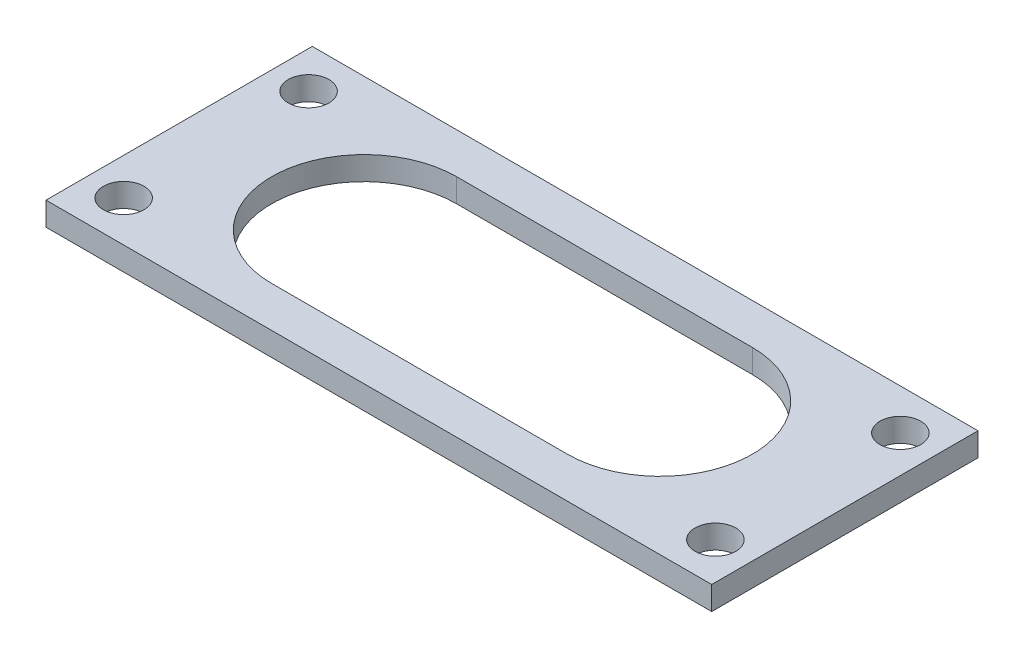
ISO-10303-21;
HEADER;
FILE_DESCRIPTION(('STEP AP214'),'2;1');
FILE_NAME('part.step','',(''),(''),'','','');
FILE_SCHEMA(('AUTOMOTIVE_DESIGN { 1 0 10303 214 1 1 1 1 }'));
ENDSEC;
DATA;
#1=APPLICATION_CONTEXT('core data for automotive mechanical design processes');
#2=APPLICATION_PROTOCOL_DEFINITION('international standard','automotive_design',2000,#1);
#3=PRODUCT_CONTEXT('',#1,'mechanical');
#4=PRODUCT('Part','Part','',(#3));
#5=PRODUCT_RELATED_PRODUCT_CATEGORY('part','',(#4));
#6=PRODUCT_DEFINITION_FORMATION('','',#4);
#7=PRODUCT_DEFINITION_CONTEXT('part definition',#1,'design');
#8=PRODUCT_DEFINITION('design','',#6,#7);
#9=PRODUCT_DEFINITION_SHAPE('','',#8);
#10=(LENGTH_UNIT() NAMED_UNIT(*) SI_UNIT(.MILLI.,.METRE.));
#11=(NAMED_UNIT(*) PLANE_ANGLE_UNIT() SI_UNIT($,.RADIAN.));
#12=(NAMED_UNIT(*) SI_UNIT($,.STERADIAN.) SOLID_ANGLE_UNIT());
#13=UNCERTAINTY_MEASURE_WITH_UNIT(LENGTH_MEASURE(1.E-05),#10,'distance_accuracy_value','');
#14=(GEOMETRIC_REPRESENTATION_CONTEXT(3) GLOBAL_UNCERTAINTY_ASSIGNED_CONTEXT((#13)) GLOBAL_UNIT_ASSIGNED_CONTEXT((#10,
#11,#12)) REPRESENTATION_CONTEXT('',''));
#15=CARTESIAN_POINT('',(0.,0.,0.));
#16=DIRECTION('',(0.,0.,1.));
#17=DIRECTION('',(1.,0.,0.));
#18=AXIS2_PLACEMENT_3D('',#15,#16,#17);
#19=CARTESIAN_POINT('',(-45.,3.175,18.));
#20=DIRECTION('',(1.,0.,0.));
#21=DIRECTION('',(0.,0.,-1.));
#22=AXIS2_PLACEMENT_3D('',#19,#20,#21);
#23=PLANE('',#22);
#24=DIRECTION('',(0.,0.,1.));
#25=VECTOR('',#24,1.);
#26=CARTESIAN_POINT('',(-45.,0.,18.));
#27=LINE('',#26,#25);
#28=CARTESIAN_POINT('',(-45.,0.,-18.));
#29=VERTEX_POINT('',#28);
#30=CARTESIAN_POINT('',(-45.,0.,18.));
#31=VERTEX_POINT('',#30);
#32=EDGE_CURVE('E169',#29,#31,#27,.T.);
#33=ORIENTED_EDGE('',*,*,#32,.T.);
#34=DIRECTION('',(0.,-1.,0.));
#35=VECTOR('',#34,1.);
#36=CARTESIAN_POINT('',(-45.,3.175,18.));
#37=LINE('',#36,#35);
#38=CARTESIAN_POINT('',(-45.,3.175,18.));
#39=VERTEX_POINT('',#38);
#40=EDGE_CURVE('E11',#39,#31,#37,.T.);
#41=ORIENTED_EDGE('',*,*,#40,.F.);
#42=DIRECTION('',(0.,0.,1.));
#43=VECTOR('',#42,1.);
#44=CARTESIAN_POINT('',(-45.,3.175,18.));
#45=LINE('',#44,#43);
#46=CARTESIAN_POINT('',(-45.,3.175,-18.));
#47=VERTEX_POINT('',#46);
#48=EDGE_CURVE('E170',#47,#39,#45,.T.);
#49=ORIENTED_EDGE('',*,*,#48,.F.);
#50=DIRECTION('',(0.,-1.,0.));
#51=VECTOR('',#50,1.);
#52=CARTESIAN_POINT('',(-45.,3.175,-18.));
#53=LINE('',#52,#51);
#54=EDGE_CURVE('E182',#47,#29,#53,.T.);
#55=ORIENTED_EDGE('',*,*,#54,.T.);
#56=EDGE_LOOP('',(#33,#41,#49,#55));
#57=FACE_BOUND('',#56,.T.);
#58=ADVANCED_FACE('F40',(#57),#23,.F.);
#59=CARTESIAN_POINT('',(45.,3.175,18.));
#60=DIRECTION('',(0.,0.,-1.));
#61=DIRECTION('',(-1.,0.,0.));
#62=AXIS2_PLACEMENT_3D('',#59,#60,#61);
#63=PLANE('',#62);
#64=DIRECTION('',(1.,0.,0.));
#65=VECTOR('',#64,1.);
#66=CARTESIAN_POINT('',(45.,0.,18.));
#67=LINE('',#66,#65);
#68=CARTESIAN_POINT('',(45.,0.,18.));
#69=VERTEX_POINT('',#68);
#70=EDGE_CURVE('E186',#31,#69,#67,.T.);
#71=ORIENTED_EDGE('',*,*,#70,.T.);
#72=DIRECTION('',(0.,-1.,0.));
#73=VECTOR('',#72,1.);
#74=CARTESIAN_POINT('',(45.,3.175,18.));
#75=LINE('',#74,#73);
#76=CARTESIAN_POINT('',(45.,3.175,18.));
#77=VERTEX_POINT('',#76);
#78=EDGE_CURVE('E47',#77,#69,#75,.T.);
#79=ORIENTED_EDGE('',*,*,#78,.F.);
#80=DIRECTION('',(1.,0.,0.));
#81=VECTOR('',#80,1.);
#82=CARTESIAN_POINT('',(45.,3.175,18.));
#83=LINE('',#82,#81);
#84=EDGE_CURVE('E174',#39,#77,#83,.T.);
#85=ORIENTED_EDGE('',*,*,#84,.F.);
#86=ORIENTED_EDGE('',*,*,#40,.T.);
#87=EDGE_LOOP('',(#71,#79,#85,#86));
#88=FACE_BOUND('',#87,.T.);
#89=ADVANCED_FACE('F217',(#88),#63,.F.);
#90=CARTESIAN_POINT('',(45.,3.175,18.));
#91=DIRECTION('',(-1.,0.,0.));
#92=DIRECTION('',(0.,0.,1.));
#93=AXIS2_PLACEMENT_3D('',#90,#91,#92);
#94=PLANE('',#93);
#95=DIRECTION('',(0.,0.,-1.));
#96=VECTOR('',#95,1.);
#97=CARTESIAN_POINT('',(45.,0.,18.));
#98=LINE('',#97,#96);
#99=CARTESIAN_POINT('',(45.,0.,-18.));
#100=VERTEX_POINT('',#99);
#101=EDGE_CURVE('E188',#69,#100,#98,.T.);
#102=ORIENTED_EDGE('',*,*,#101,.T.);
#103=DIRECTION('',(0.,-1.,0.));
#104=VECTOR('',#103,1.);
#105=CARTESIAN_POINT('',(45.,3.175,-18.));
#106=LINE('',#105,#104);
#107=CARTESIAN_POINT('',(45.,3.175,-18.));
#108=VERTEX_POINT('',#107);
#109=EDGE_CURVE('E195',#108,#100,#106,.T.);
#110=ORIENTED_EDGE('',*,*,#109,.F.);
#111=DIRECTION('',(0.,0.,-1.));
#112=VECTOR('',#111,1.);
#113=CARTESIAN_POINT('',(45.,3.175,18.));
#114=LINE('',#113,#112);
#115=EDGE_CURVE('E177',#77,#108,#114,.T.);
#116=ORIENTED_EDGE('',*,*,#115,.F.);
#117=ORIENTED_EDGE('',*,*,#78,.T.);
#118=EDGE_LOOP('',(#102,#110,#116,#117));
#119=FACE_BOUND('',#118,.T.);
#120=ADVANCED_FACE('F202',(#119),#94,.F.);
#121=CARTESIAN_POINT('',(45.,3.175,-18.));
#122=DIRECTION('',(0.,0.,1.));
#123=DIRECTION('',(1.,0.,0.));
#124=AXIS2_PLACEMENT_3D('',#121,#122,#123);
#125=PLANE('',#124);
#126=DIRECTION('',(-1.,0.,0.));
#127=VECTOR('',#126,1.);
#128=CARTESIAN_POINT('',(45.,0.,-18.));
#129=LINE('',#128,#127);
#130=EDGE_CURVE('E175',#100,#29,#129,.T.);
#131=ORIENTED_EDGE('',*,*,#130,.T.);
#132=ORIENTED_EDGE('',*,*,#54,.F.);
#133=DIRECTION('',(-1.,0.,0.));
#134=VECTOR('',#133,1.);
#135=CARTESIAN_POINT('',(45.,3.175,-18.));
#136=LINE('',#135,#134);
#137=EDGE_CURVE('E179',#108,#47,#136,.T.);
#138=ORIENTED_EDGE('',*,*,#137,.F.);
#139=ORIENTED_EDGE('',*,*,#109,.T.);
#140=EDGE_LOOP('',(#131,#132,#138,#139));
#141=FACE_BOUND('',#140,.T.);
#142=ADVANCED_FACE('F210',(#141),#125,.F.);
#143=CARTESIAN_POINT('',(0.,3.175,0.));
#144=DIRECTION('',(0.,1.,0.));
#145=DIRECTION('',(0.,0.,1.));
#146=AXIS2_PLACEMENT_3D('',#143,#144,#145);
#147=PLANE('',#146);
#148=CARTESIAN_POINT('',(20.,3.175,0.));
#149=DIRECTION('',(0.,1.,0.));
#150=DIRECTION('',(0.,0.,1.));
#151=AXIS2_PLACEMENT_3D('',#148,#149,#150);
#152=CIRCLE('',#151,12.5);
#153=CARTESIAN_POINT('',(20.,3.175,12.5));
#154=VERTEX_POINT('',#153);
#155=CARTESIAN_POINT('',(20.,3.175,-12.5));
#156=VERTEX_POINT('',#155);
#157=EDGE_CURVE('E54',#154,#156,#152,.T.);
#158=ORIENTED_EDGE('',*,*,#157,.F.);
#159=DIRECTION('',(1.,0.,0.));
#160=VECTOR('',#159,1.);
#161=CARTESIAN_POINT('',(20.,3.175,12.5));
#162=LINE('',#161,#160);
#163=CARTESIAN_POINT('',(-20.,3.175,12.5));
#164=VERTEX_POINT('',#163);
#165=EDGE_CURVE('E114',#164,#154,#162,.T.);
#166=ORIENTED_EDGE('',*,*,#165,.F.);
#167=CARTESIAN_POINT('',(-20.,3.175,0.));
#168=DIRECTION('',(0.,1.,0.));
#169=DIRECTION('',(0.,0.,1.));
#170=AXIS2_PLACEMENT_3D('',#167,#168,#169);
#171=CIRCLE('',#170,12.5);
#172=CARTESIAN_POINT('',(-20.,3.175,-12.5));
#173=VERTEX_POINT('',#172);
#174=EDGE_CURVE('E134',#173,#164,#171,.T.);
#175=ORIENTED_EDGE('',*,*,#174,.F.);
#176=DIRECTION('',(-1.,0.,0.));
#177=VECTOR('',#176,1.);
#178=CARTESIAN_POINT('',(20.,3.175,-12.5));
#179=LINE('',#178,#177);
#180=EDGE_CURVE('E128',#156,#173,#179,.T.);
#181=ORIENTED_EDGE('',*,*,#180,.F.);
#182=EDGE_LOOP('',(#158,#166,#175,#181));
#183=FACE_BOUND('',#182,.T.);
#184=CARTESIAN_POINT('',(40.,3.175,12.5));
#185=DIRECTION('',(0.,1.,0.));
#186=DIRECTION('',(0.,0.,1.));
#187=AXIS2_PLACEMENT_3D('',#184,#185,#186);
#188=CIRCLE('',#187,2.75);
#189=CARTESIAN_POINT('',(40.,3.175,15.25));
#190=VERTEX_POINT('',#189);
#191=EDGE_CURVE('E120',#190,#190,#188,.T.);
#192=ORIENTED_EDGE('',*,*,#191,.F.);
#193=EDGE_LOOP('',(#192));
#194=FACE_BOUND('',#193,.T.);
#195=CARTESIAN_POINT('',(-40.,3.175,12.5));
#196=DIRECTION('',(0.,1.,0.));
#197=DIRECTION('',(0.,0.,1.));
#198=AXIS2_PLACEMENT_3D('',#195,#196,#197);
#199=CIRCLE('',#198,2.74999999999999);
#200=CARTESIAN_POINT('',(-40.,3.175,15.25));
#201=VERTEX_POINT('',#200);
#202=EDGE_CURVE('E153',#201,#201,#199,.T.);
#203=ORIENTED_EDGE('',*,*,#202,.F.);
#204=EDGE_LOOP('',(#203));
#205=FACE_BOUND('',#204,.T.);
#206=CARTESIAN_POINT('',(-40.,3.175,-12.5));
#207=DIRECTION('',(0.,1.,0.));
#208=DIRECTION('',(0.,0.,1.));
#209=AXIS2_PLACEMENT_3D('',#206,#207,#208);
#210=CIRCLE('',#209,2.74999999999999);
#211=CARTESIAN_POINT('',(-40.,3.175,-9.75000000000001));
#212=VERTEX_POINT('',#211);
#213=EDGE_CURVE('E143',#212,#212,#210,.T.);
#214=ORIENTED_EDGE('',*,*,#213,.F.);
#215=EDGE_LOOP('',(#214));
#216=FACE_BOUND('',#215,.T.);
#217=CARTESIAN_POINT('',(40.,3.175,-12.5));
#218=DIRECTION('',(0.,1.,0.));
#219=DIRECTION('',(0.,0.,1.));
#220=AXIS2_PLACEMENT_3D('',#217,#218,#219);
#221=CIRCLE('',#220,2.75);
#222=CARTESIAN_POINT('',(40.,3.175,-9.75));
#223=VERTEX_POINT('',#222);
#224=EDGE_CURVE('E152',#223,#223,#221,.T.);
#225=ORIENTED_EDGE('',*,*,#224,.F.);
#226=EDGE_LOOP('',(#225));
#227=FACE_BOUND('',#226,.T.);
#228=ORIENTED_EDGE('',*,*,#48,.T.);
#229=ORIENTED_EDGE('',*,*,#84,.T.);
#230=ORIENTED_EDGE('',*,*,#115,.T.);
#231=ORIENTED_EDGE('',*,*,#137,.T.);
#232=EDGE_LOOP('',(#228,#229,#230,#231));
#233=FACE_BOUND('',#232,.T.);
#234=ADVANCED_FACE('F216',(#183,#194,#205,#216,#227,#233),#147,.T.);
#235=CARTESIAN_POINT('',(0.,0.,0.));
#236=DIRECTION('',(0.,1.,0.));
#237=DIRECTION('',(0.,0.,1.));
#238=AXIS2_PLACEMENT_3D('',#235,#236,#237);
#239=PLANE('',#238);
#240=DIRECTION('',(-1.,0.,0.));
#241=VECTOR('',#240,1.);
#242=CARTESIAN_POINT('',(20.,0.,12.5));
#243=LINE('',#242,#241);
#244=CARTESIAN_POINT('',(20.,0.,12.5));
#245=VERTEX_POINT('',#244);
#246=CARTESIAN_POINT('',(-20.,0.,12.5));
#247=VERTEX_POINT('',#246);
#248=EDGE_CURVE('E126',#245,#247,#243,.T.);
#249=ORIENTED_EDGE('',*,*,#248,.F.);
#250=CARTESIAN_POINT('',(20.,0.,0.));
#251=DIRECTION('',(0.,1.,0.));
#252=DIRECTION('',(0.,0.,1.));
#253=AXIS2_PLACEMENT_3D('',#250,#251,#252);
#254=CIRCLE('',#253,12.5);
#255=CARTESIAN_POINT('',(20.,0.,-12.5));
#256=VERTEX_POINT('',#255);
#257=EDGE_CURVE('E108',#256,#245,#254,.F.);
#258=ORIENTED_EDGE('',*,*,#257,.F.);
#259=DIRECTION('',(1.,0.,0.));
#260=VECTOR('',#259,1.);
#261=CARTESIAN_POINT('',(20.,0.,-12.5));
#262=LINE('',#261,#260);
#263=CARTESIAN_POINT('',(-20.,0.,-12.5));
#264=VERTEX_POINT('',#263);
#265=EDGE_CURVE('E117',#264,#256,#262,.T.);
#266=ORIENTED_EDGE('',*,*,#265,.F.);
#267=CARTESIAN_POINT('',(-20.,0.,0.));
#268=DIRECTION('',(0.,1.,0.));
#269=DIRECTION('',(0.,0.,1.));
#270=AXIS2_PLACEMENT_3D('',#267,#268,#269);
#271=CIRCLE('',#270,12.5);
#272=EDGE_CURVE('E62',#247,#264,#271,.F.);
#273=ORIENTED_EDGE('',*,*,#272,.F.);
#274=EDGE_LOOP('',(#249,#258,#266,#273));
#275=FACE_BOUND('',#274,.T.);
#276=CARTESIAN_POINT('',(40.,0.,12.5));
#277=DIRECTION('',(0.,1.,0.));
#278=DIRECTION('',(0.,0.,1.));
#279=AXIS2_PLACEMENT_3D('',#276,#277,#278);
#280=CIRCLE('',#279,2.75);
#281=CARTESIAN_POINT('',(40.,0.,15.25));
#282=VERTEX_POINT('',#281);
#283=EDGE_CURVE('E157',#282,#282,#280,.F.);
#284=ORIENTED_EDGE('',*,*,#283,.F.);
#285=EDGE_LOOP('',(#284));
#286=FACE_BOUND('',#285,.T.);
#287=CARTESIAN_POINT('',(-40.,0.,12.5));
#288=DIRECTION('',(0.,1.,0.));
#289=DIRECTION('',(0.,0.,1.));
#290=AXIS2_PLACEMENT_3D('',#287,#288,#289);
#291=CIRCLE('',#290,2.74999999999999);
#292=CARTESIAN_POINT('',(-40.,0.,15.25));
#293=VERTEX_POINT('',#292);
#294=EDGE_CURVE('E148',#293,#293,#291,.F.);
#295=ORIENTED_EDGE('',*,*,#294,.F.);
#296=EDGE_LOOP('',(#295));
#297=FACE_BOUND('',#296,.T.);
#298=CARTESIAN_POINT('',(-40.,0.,-12.5));
#299=DIRECTION('',(0.,1.,0.));
#300=DIRECTION('',(0.,0.,1.));
#301=AXIS2_PLACEMENT_3D('',#298,#299,#300);
#302=CIRCLE('',#301,2.74999999999999);
#303=CARTESIAN_POINT('',(-40.,0.,-9.75000000000001));
#304=VERTEX_POINT('',#303);
#305=EDGE_CURVE('E147',#304,#304,#302,.F.);
#306=ORIENTED_EDGE('',*,*,#305,.F.);
#307=EDGE_LOOP('',(#306));
#308=FACE_BOUND('',#307,.T.);
#309=CARTESIAN_POINT('',(40.,0.,-12.5));
#310=DIRECTION('',(0.,1.,0.));
#311=DIRECTION('',(0.,0.,1.));
#312=AXIS2_PLACEMENT_3D('',#309,#310,#311);
#313=CIRCLE('',#312,2.75);
#314=CARTESIAN_POINT('',(40.,0.,-9.75));
#315=VERTEX_POINT('',#314);
#316=EDGE_CURVE('E166',#315,#315,#313,.F.);
#317=ORIENTED_EDGE('',*,*,#316,.F.);
#318=EDGE_LOOP('',(#317));
#319=FACE_BOUND('',#318,.T.);
#320=ORIENTED_EDGE('',*,*,#32,.F.);
#321=ORIENTED_EDGE('',*,*,#130,.F.);
#322=ORIENTED_EDGE('',*,*,#101,.F.);
#323=ORIENTED_EDGE('',*,*,#70,.F.);
#324=EDGE_LOOP('',(#320,#321,#322,#323));
#325=FACE_BOUND('',#324,.T.);
#326=ADVANCED_FACE('F123',(#275,#286,#297,#308,#319,#325),#239,.F.);
#327=CARTESIAN_POINT('',(40.,-0.00100000000000013,-12.5));
#328=DIRECTION('',(0.,1.,0.));
#329=DIRECTION('',(0.,0.,1.));
#330=AXIS2_PLACEMENT_3D('',#327,#328,#329);
#331=CYLINDRICAL_SURFACE('',#330,2.75);
#332=ORIENTED_EDGE('',*,*,#224,.T.);
#333=EDGE_LOOP('',(#332));
#334=FACE_BOUND('',#333,.T.);
#335=ORIENTED_EDGE('',*,*,#316,.T.);
#336=EDGE_LOOP('',(#335));
#337=FACE_BOUND('',#336,.T.);
#338=ADVANCED_FACE('F229',(#334,#337),#331,.F.);
#339=CARTESIAN_POINT('',(-40.,-0.00100000000000013,-12.5));
#340=DIRECTION('',(0.,1.,0.));
#341=DIRECTION('',(0.,0.,1.));
#342=AXIS2_PLACEMENT_3D('',#339,#340,#341);
#343=CYLINDRICAL_SURFACE('',#342,2.74999999999999);
#344=ORIENTED_EDGE('',*,*,#213,.T.);
#345=EDGE_LOOP('',(#344));
#346=FACE_BOUND('',#345,.T.);
#347=ORIENTED_EDGE('',*,*,#305,.T.);
#348=EDGE_LOOP('',(#347));
#349=FACE_BOUND('',#348,.T.);
#350=ADVANCED_FACE('F235',(#346,#349),#343,.F.);
#351=CARTESIAN_POINT('',(-40.,-0.00100000000000013,12.5));
#352=DIRECTION('',(0.,1.,0.));
#353=DIRECTION('',(0.,0.,1.));
#354=AXIS2_PLACEMENT_3D('',#351,#352,#353);
#355=CYLINDRICAL_SURFACE('',#354,2.74999999999999);
#356=ORIENTED_EDGE('',*,*,#202,.T.);
#357=EDGE_LOOP('',(#356));
#358=FACE_BOUND('',#357,.T.);
#359=ORIENTED_EDGE('',*,*,#294,.T.);
#360=EDGE_LOOP('',(#359));
#361=FACE_BOUND('',#360,.T.);
#362=ADVANCED_FACE('F240',(#358,#361),#355,.F.);
#363=CARTESIAN_POINT('',(40.,-0.00100000000000013,12.5));
#364=DIRECTION('',(0.,1.,0.));
#365=DIRECTION('',(0.,0.,1.));
#366=AXIS2_PLACEMENT_3D('',#363,#364,#365);
#367=CYLINDRICAL_SURFACE('',#366,2.75);
#368=ORIENTED_EDGE('',*,*,#191,.T.);
#369=EDGE_LOOP('',(#368));
#370=FACE_BOUND('',#369,.T.);
#371=ORIENTED_EDGE('',*,*,#283,.T.);
#372=EDGE_LOOP('',(#371));
#373=FACE_BOUND('',#372,.T.);
#374=ADVANCED_FACE('F237',(#370,#373),#367,.F.);
#375=CARTESIAN_POINT('',(20.,-0.00100000000000013,0.));
#376=DIRECTION('',(0.,1.,0.));
#377=DIRECTION('',(0.,0.,1.));
#378=AXIS2_PLACEMENT_3D('',#375,#376,#377);
#379=CYLINDRICAL_SURFACE('',#378,12.5);
#380=ORIENTED_EDGE('',*,*,#257,.T.);
#381=DIRECTION('',(0.,1.,0.));
#382=VECTOR('',#381,1.);
#383=CARTESIAN_POINT('',(20.,-0.00100000000000013,12.5));
#384=LINE('',#383,#382);
#385=EDGE_CURVE('E121',#245,#154,#384,.T.);
#386=ORIENTED_EDGE('',*,*,#385,.T.);
#387=ORIENTED_EDGE('',*,*,#157,.T.);
#388=DIRECTION('',(0.,1.,0.));
#389=VECTOR('',#388,1.);
#390=CARTESIAN_POINT('',(20.,-0.00100000000000013,-12.5));
#391=LINE('',#390,#389);
#392=EDGE_CURVE('E104',#256,#156,#391,.T.);
#393=ORIENTED_EDGE('',*,*,#392,.F.);
#394=EDGE_LOOP('',(#380,#386,#387,#393));
#395=FACE_BOUND('',#394,.T.);
#396=ADVANCED_FACE('F106',(#395),#379,.F.);
#397=CARTESIAN_POINT('',(20.,-0.00100000000000013,12.5));
#398=DIRECTION('',(0.,0.,1.));
#399=DIRECTION('',(1.,0.,0.));
#400=AXIS2_PLACEMENT_3D('',#397,#398,#399);
#401=PLANE('',#400);
#402=ORIENTED_EDGE('',*,*,#248,.T.);
#403=DIRECTION('',(0.,1.,0.));
#404=VECTOR('',#403,1.);
#405=CARTESIAN_POINT('',(-20.,-0.00100000000000013,12.5));
#406=LINE('',#405,#404);
#407=EDGE_CURVE('E140',#247,#164,#406,.T.);
#408=ORIENTED_EDGE('',*,*,#407,.T.);
#409=ORIENTED_EDGE('',*,*,#165,.T.);
#410=ORIENTED_EDGE('',*,*,#385,.F.);
#411=EDGE_LOOP('',(#402,#408,#409,#410));
#412=FACE_BOUND('',#411,.T.);
#413=ADVANCED_FACE('F250',(#412),#401,.F.);
#414=CARTESIAN_POINT('',(-20.,-0.00100000000000013,0.));
#415=DIRECTION('',(0.,1.,0.));
#416=DIRECTION('',(0.,0.,1.));
#417=AXIS2_PLACEMENT_3D('',#414,#415,#416);
#418=CYLINDRICAL_SURFACE('',#417,12.5);
#419=ORIENTED_EDGE('',*,*,#272,.T.);
#420=DIRECTION('',(0.,1.,0.));
#421=VECTOR('',#420,1.);
#422=CARTESIAN_POINT('',(-20.,-0.00100000000000013,-12.5));
#423=LINE('',#422,#421);
#424=EDGE_CURVE('E113',#264,#173,#423,.T.);
#425=ORIENTED_EDGE('',*,*,#424,.T.);
#426=ORIENTED_EDGE('',*,*,#174,.T.);
#427=ORIENTED_EDGE('',*,*,#407,.F.);
#428=EDGE_LOOP('',(#419,#425,#426,#427));
#429=FACE_BOUND('',#428,.T.);
#430=ADVANCED_FACE('F253',(#429),#418,.F.);
#431=CARTESIAN_POINT('',(20.,-0.00100000000000013,-12.5));
#432=DIRECTION('',(0.,0.,-1.));
#433=DIRECTION('',(-1.,0.,0.));
#434=AXIS2_PLACEMENT_3D('',#431,#432,#433);
#435=PLANE('',#434);
#436=ORIENTED_EDGE('',*,*,#265,.T.);
#437=ORIENTED_EDGE('',*,*,#392,.T.);
#438=ORIENTED_EDGE('',*,*,#180,.T.);
#439=ORIENTED_EDGE('',*,*,#424,.F.);
#440=EDGE_LOOP('',(#436,#437,#438,#439));
#441=FACE_BOUND('',#440,.T.);
#442=ADVANCED_FACE('F118',(#441),#435,.F.);
#443=CLOSED_SHELL('',(#58,#89,#120,#142,#234,#326,#338,#350,#362,#374,#396,#413,#430,#442));
#444=MANIFOLD_SOLID_BREP('B2',#443);
#445=ADVANCED_BREP_SHAPE_REPRESENTATION('',(#18,#444),#14);
#446=SHAPE_DEFINITION_REPRESENTATION(#9,#445);
ENDSEC;
END-ISO-10303-21;
